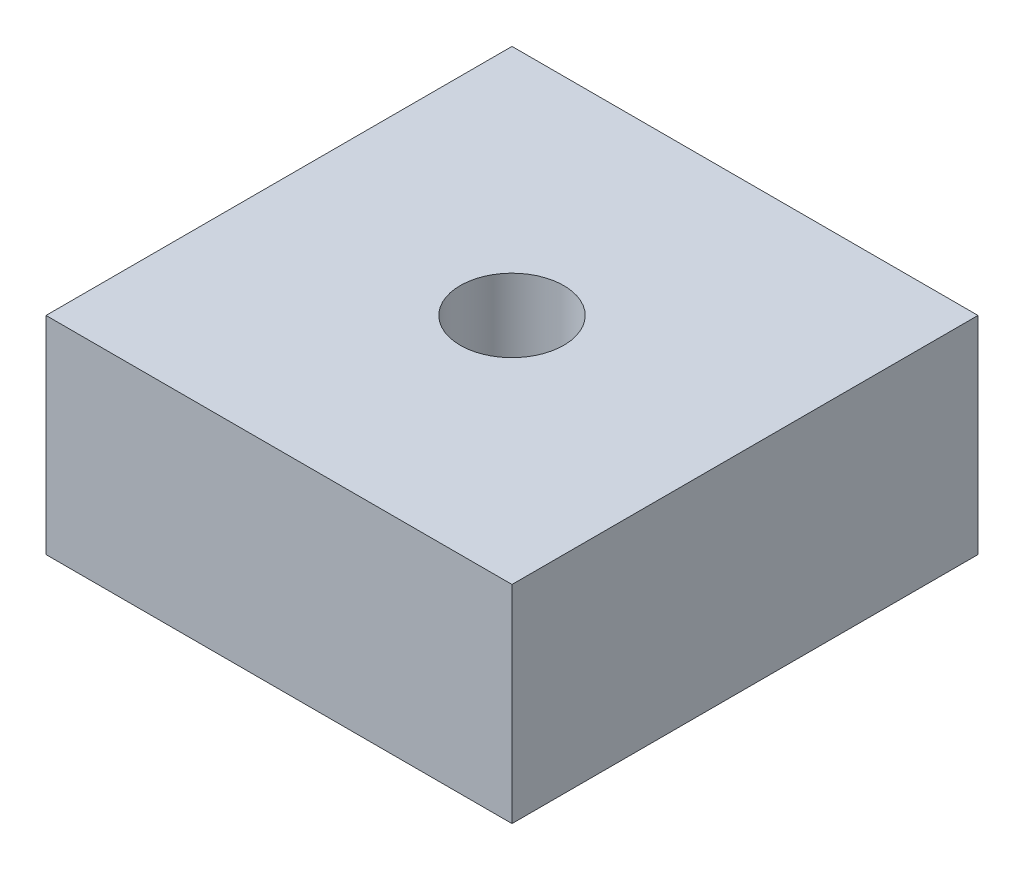
ISO-10303-21;
HEADER;
FILE_DESCRIPTION(('STEP AP214'),'2;1');
FILE_NAME('part.step','',(''),(''),'','','');
FILE_SCHEMA(('AUTOMOTIVE_DESIGN { 1 0 10303 214 1 1 1 1 }'));
ENDSEC;
DATA;
#1=APPLICATION_CONTEXT('core data for automotive mechanical design processes');
#2=APPLICATION_PROTOCOL_DEFINITION('international standard','automotive_design',2000,#1);
#3=PRODUCT_CONTEXT('',#1,'mechanical');
#4=PRODUCT('Part','Part','',(#3));
#5=PRODUCT_RELATED_PRODUCT_CATEGORY('part','',(#4));
#6=PRODUCT_DEFINITION_FORMATION('','',#4);
#7=PRODUCT_DEFINITION_CONTEXT('part definition',#1,'design');
#8=PRODUCT_DEFINITION('design','',#6,#7);
#9=PRODUCT_DEFINITION_SHAPE('','',#8);
#10=(LENGTH_UNIT() NAMED_UNIT(*) SI_UNIT(.MILLI.,.METRE.));
#11=(NAMED_UNIT(*) PLANE_ANGLE_UNIT() SI_UNIT($,.RADIAN.));
#12=(NAMED_UNIT(*) SI_UNIT($,.STERADIAN.) SOLID_ANGLE_UNIT());
#13=UNCERTAINTY_MEASURE_WITH_UNIT(LENGTH_MEASURE(1.E-05),#10,'distance_accuracy_value','');
#14=(GEOMETRIC_REPRESENTATION_CONTEXT(3) GLOBAL_UNCERTAINTY_ASSIGNED_CONTEXT((#13)) GLOBAL_UNIT_ASSIGNED_CONTEXT((#10,
#11,#12)) REPRESENTATION_CONTEXT('',''));
#15=CARTESIAN_POINT('',(0.,0.,0.));
#16=DIRECTION('',(0.,0.,1.));
#17=DIRECTION('',(1.,0.,0.));
#18=AXIS2_PLACEMENT_3D('',#15,#16,#17);
#19=CARTESIAN_POINT('',(0.,4.,0.));
#20=DIRECTION('',(0.,-1.,0.));
#21=DIRECTION('',(0.,0.,-1.));
#22=AXIS2_PLACEMENT_3D('',#19,#20,#21);
#23=PLANE('',#22);
#24=DIRECTION('',(0.,0.,1.));
#25=VECTOR('',#24,1.);
#26=CARTESIAN_POINT('',(0.,4.,0.));
#27=LINE('',#26,#25);
#28=CARTESIAN_POINT('',(0.,4.,-9.));
#29=VERTEX_POINT('',#28);
#30=CARTESIAN_POINT('',(0.,4.,0.));
#31=VERTEX_POINT('',#30);
#32=EDGE_CURVE('E92',#29,#31,#27,.T.);
#33=ORIENTED_EDGE('',*,*,#32,.T.);
#34=DIRECTION('',(1.,0.,0.));
#35=VECTOR('',#34,1.);
#36=CARTESIAN_POINT('',(0.,4.,0.));
#37=LINE('',#36,#35);
#38=CARTESIAN_POINT('',(9.,4.,0.));
#39=VERTEX_POINT('',#38);
#40=EDGE_CURVE('E87',#31,#39,#37,.T.);
#41=ORIENTED_EDGE('',*,*,#40,.T.);
#42=DIRECTION('',(0.,0.,-1.));
#43=VECTOR('',#42,1.);
#44=CARTESIAN_POINT('',(9.,4.,0.));
#45=LINE('',#44,#43);
#46=CARTESIAN_POINT('',(9.,4.,-9.));
#47=VERTEX_POINT('',#46);
#48=EDGE_CURVE('E90',#39,#47,#45,.T.);
#49=ORIENTED_EDGE('',*,*,#48,.T.);
#50=DIRECTION('',(-1.,0.,0.));
#51=VECTOR('',#50,1.);
#52=CARTESIAN_POINT('',(0.,4.,-9.));
#53=LINE('',#52,#51);
#54=EDGE_CURVE('E57',#47,#29,#53,.T.);
#55=ORIENTED_EDGE('',*,*,#54,.T.);
#56=EDGE_LOOP('',(#33,#41,#49,#55));
#57=FACE_BOUND('',#56,.T.);
#58=CARTESIAN_POINT('',(4.5,4.,-4.5));
#59=DIRECTION('',(0.,1.,0.));
#60=DIRECTION('',(0.,0.,1.));
#61=AXIS2_PLACEMENT_3D('',#58,#59,#60);
#62=CIRCLE('',#61,1.);
#63=CARTESIAN_POINT('',(4.5,4.,-3.5));
#64=VERTEX_POINT('',#63);
#65=EDGE_CURVE('E112',#64,#64,#62,.T.);
#66=ORIENTED_EDGE('',*,*,#65,.F.);
#67=EDGE_LOOP('',(#66));
#68=FACE_BOUND('',#67,.T.);
#69=ADVANCED_FACE('F39',(#57,#68),#23,.F.);
#70=CARTESIAN_POINT('',(0.,0.,0.));
#71=DIRECTION('',(0.,-1.,0.));
#72=DIRECTION('',(0.,0.,-1.));
#73=AXIS2_PLACEMENT_3D('',#70,#71,#72);
#74=PLANE('',#73);
#75=DIRECTION('',(0.,0.,1.));
#76=VECTOR('',#75,1.);
#77=CARTESIAN_POINT('',(0.,0.,0.));
#78=LINE('',#77,#76);
#79=CARTESIAN_POINT('',(0.,0.,-9.));
#80=VERTEX_POINT('',#79);
#81=CARTESIAN_POINT('',(0.,0.,0.));
#82=VERTEX_POINT('',#81);
#83=EDGE_CURVE('E108',#80,#82,#78,.T.);
#84=ORIENTED_EDGE('',*,*,#83,.F.);
#85=DIRECTION('',(-1.,0.,0.));
#86=VECTOR('',#85,1.);
#87=CARTESIAN_POINT('',(0.,0.,-9.));
#88=LINE('',#87,#86);
#89=CARTESIAN_POINT('',(9.,0.,-9.));
#90=VERTEX_POINT('',#89);
#91=EDGE_CURVE('E80',#90,#80,#88,.T.);
#92=ORIENTED_EDGE('',*,*,#91,.F.);
#93=DIRECTION('',(0.,0.,-1.));
#94=VECTOR('',#93,1.);
#95=CARTESIAN_POINT('',(9.,0.,0.));
#96=LINE('',#95,#94);
#97=CARTESIAN_POINT('',(9.,0.,0.));
#98=VERTEX_POINT('',#97);
#99=EDGE_CURVE('E74',#98,#90,#96,.T.);
#100=ORIENTED_EDGE('',*,*,#99,.F.);
#101=DIRECTION('',(1.,0.,0.));
#102=VECTOR('',#101,1.);
#103=CARTESIAN_POINT('',(0.,0.,0.));
#104=LINE('',#103,#102);
#105=EDGE_CURVE('E97',#82,#98,#104,.T.);
#106=ORIENTED_EDGE('',*,*,#105,.F.);
#107=EDGE_LOOP('',(#84,#92,#100,#106));
#108=FACE_BOUND('',#107,.T.);
#109=CARTESIAN_POINT('',(4.5,0.,-4.5));
#110=DIRECTION('',(0.,1.,0.));
#111=DIRECTION('',(0.,0.,1.));
#112=AXIS2_PLACEMENT_3D('',#109,#110,#111);
#113=CIRCLE('',#112,1.);
#114=CARTESIAN_POINT('',(4.5,0.,-3.5));
#115=VERTEX_POINT('',#114);
#116=EDGE_CURVE('E130',#115,#115,#113,.T.);
#117=ORIENTED_EDGE('',*,*,#116,.T.);
#118=EDGE_LOOP('',(#117));
#119=FACE_BOUND('',#118,.T.);
#120=ADVANCED_FACE('F125',(#108,#119),#74,.T.);
#121=CARTESIAN_POINT('',(0.,4.,0.));
#122=DIRECTION('',(1.,0.,0.));
#123=DIRECTION('',(0.,0.,-1.));
#124=AXIS2_PLACEMENT_3D('',#121,#122,#123);
#125=PLANE('',#124);
#126=ORIENTED_EDGE('',*,*,#83,.T.);
#127=DIRECTION('',(0.,-1.,0.));
#128=VECTOR('',#127,1.);
#129=CARTESIAN_POINT('',(0.,4.,0.));
#130=LINE('',#129,#128);
#131=EDGE_CURVE('E11',#31,#82,#130,.T.);
#132=ORIENTED_EDGE('',*,*,#131,.F.);
#133=ORIENTED_EDGE('',*,*,#32,.F.);
#134=DIRECTION('',(0.,-1.,0.));
#135=VECTOR('',#134,1.);
#136=CARTESIAN_POINT('',(0.,4.,-9.));
#137=LINE('',#136,#135);
#138=EDGE_CURVE('E104',#29,#80,#137,.T.);
#139=ORIENTED_EDGE('',*,*,#138,.T.);
#140=EDGE_LOOP('',(#126,#132,#133,#139));
#141=FACE_BOUND('',#140,.T.);
#142=ADVANCED_FACE('F41',(#141),#125,.F.);
#143=CARTESIAN_POINT('',(0.,4.,0.));
#144=DIRECTION('',(0.,0.,-1.));
#145=DIRECTION('',(-1.,0.,0.));
#146=AXIS2_PLACEMENT_3D('',#143,#144,#145);
#147=PLANE('',#146);
#148=ORIENTED_EDGE('',*,*,#105,.T.);
#149=DIRECTION('',(0.,-1.,0.));
#150=VECTOR('',#149,1.);
#151=CARTESIAN_POINT('',(9.,4.,0.));
#152=LINE('',#151,#150);
#153=EDGE_CURVE('E49',#39,#98,#152,.T.);
#154=ORIENTED_EDGE('',*,*,#153,.F.);
#155=ORIENTED_EDGE('',*,*,#40,.F.);
#156=ORIENTED_EDGE('',*,*,#131,.T.);
#157=EDGE_LOOP('',(#148,#154,#155,#156));
#158=FACE_BOUND('',#157,.T.);
#159=ADVANCED_FACE('F96',(#158),#147,.F.);
#160=CARTESIAN_POINT('',(9.,4.,0.));
#161=DIRECTION('',(-1.,0.,0.));
#162=DIRECTION('',(0.,0.,1.));
#163=AXIS2_PLACEMENT_3D('',#160,#161,#162);
#164=PLANE('',#163);
#165=ORIENTED_EDGE('',*,*,#99,.T.);
#166=DIRECTION('',(0.,-1.,0.));
#167=VECTOR('',#166,1.);
#168=CARTESIAN_POINT('',(9.,4.,-9.));
#169=LINE('',#168,#167);
#170=EDGE_CURVE('E99',#47,#90,#169,.T.);
#171=ORIENTED_EDGE('',*,*,#170,.F.);
#172=ORIENTED_EDGE('',*,*,#48,.F.);
#173=ORIENTED_EDGE('',*,*,#153,.T.);
#174=EDGE_LOOP('',(#165,#171,#172,#173));
#175=FACE_BOUND('',#174,.T.);
#176=ADVANCED_FACE('F100',(#175),#164,.F.);
#177=CARTESIAN_POINT('',(0.,4.,-9.));
#178=DIRECTION('',(0.,0.,1.));
#179=DIRECTION('',(1.,0.,0.));
#180=AXIS2_PLACEMENT_3D('',#177,#178,#179);
#181=PLANE('',#180);
#182=ORIENTED_EDGE('',*,*,#91,.T.);
#183=ORIENTED_EDGE('',*,*,#138,.F.);
#184=ORIENTED_EDGE('',*,*,#54,.F.);
#185=ORIENTED_EDGE('',*,*,#170,.T.);
#186=EDGE_LOOP('',(#182,#183,#184,#185));
#187=FACE_BOUND('',#186,.T.);
#188=ADVANCED_FACE('F122',(#187),#181,.F.);
#189=CARTESIAN_POINT('',(4.5,4.,-4.5));
#190=DIRECTION('',(0.,-1.,0.));
#191=DIRECTION('',(0.,0.,-1.));
#192=AXIS2_PLACEMENT_3D('',#189,#190,#191);
#193=CYLINDRICAL_SURFACE('',#192,1.);
#194=ORIENTED_EDGE('',*,*,#65,.T.);
#195=EDGE_LOOP('',(#194));
#196=FACE_BOUND('',#195,.T.);
#197=ORIENTED_EDGE('',*,*,#116,.F.);
#198=EDGE_LOOP('',(#197));
#199=FACE_BOUND('',#198,.T.);
#200=ADVANCED_FACE('F138',(#196,#199),#193,.F.);
#201=CLOSED_SHELL('',(#69,#120,#142,#159,#176,#188,#200));
#202=MANIFOLD_SOLID_BREP('B2',#201);
#203=ADVANCED_BREP_SHAPE_REPRESENTATION('',(#18,#202),#14);
#204=SHAPE_DEFINITION_REPRESENTATION(#9,#203);
ENDSEC;
END-ISO-10303-21;
